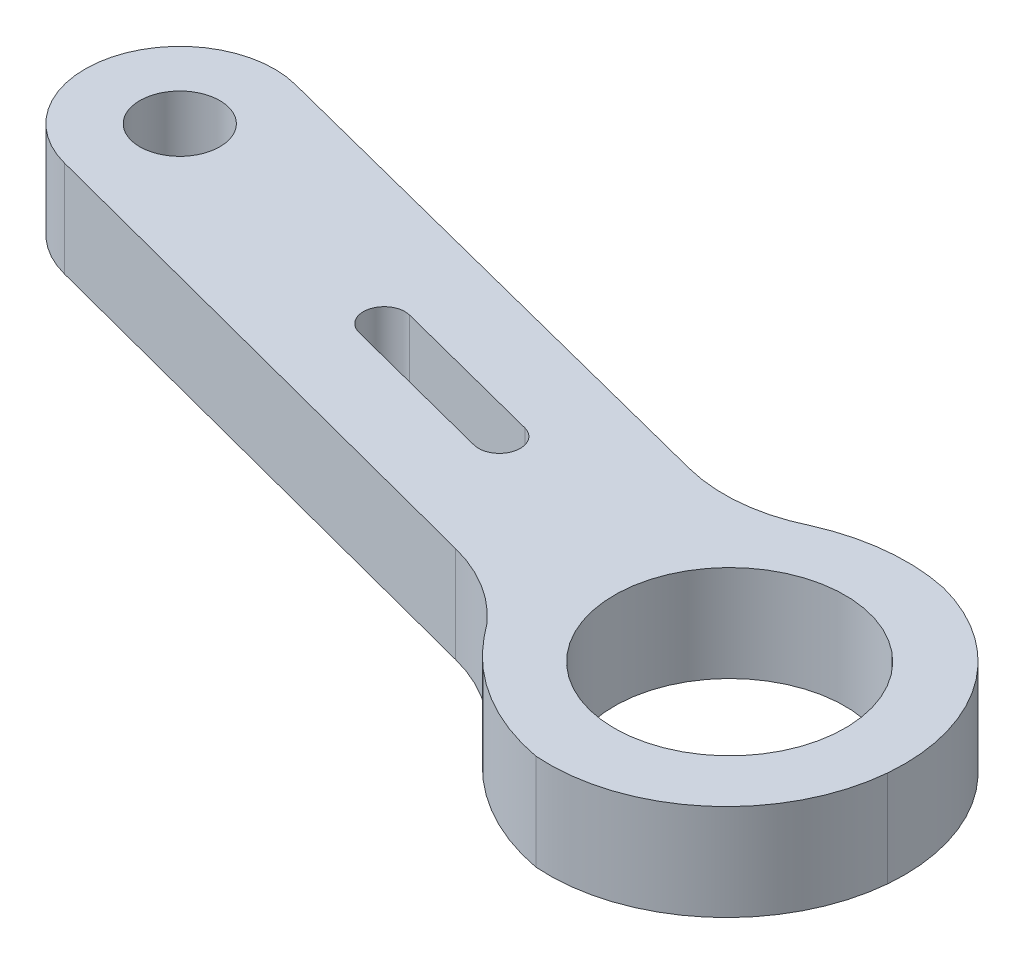
ISO-10303-21;
HEADER;
FILE_DESCRIPTION(('STEP AP214'),'2;1');
FILE_NAME('part.step','',(''),(''),'','','');
FILE_SCHEMA(('AUTOMOTIVE_DESIGN { 1 0 10303 214 1 1 1 1 }'));
ENDSEC;
DATA;
#1=APPLICATION_CONTEXT('core data for automotive mechanical design processes');
#2=APPLICATION_PROTOCOL_DEFINITION('international standard','automotive_design',2000,#1);
#3=PRODUCT_CONTEXT('',#1,'mechanical');
#4=PRODUCT('Part','Part','',(#3));
#5=PRODUCT_RELATED_PRODUCT_CATEGORY('part','',(#4));
#6=PRODUCT_DEFINITION_FORMATION('','',#4);
#7=PRODUCT_DEFINITION_CONTEXT('part definition',#1,'design');
#8=PRODUCT_DEFINITION('design','',#6,#7);
#9=PRODUCT_DEFINITION_SHAPE('','',#8);
#10=(LENGTH_UNIT() NAMED_UNIT(*) SI_UNIT(.MILLI.,.METRE.));
#11=(NAMED_UNIT(*) PLANE_ANGLE_UNIT() SI_UNIT($,.RADIAN.));
#12=(NAMED_UNIT(*) SI_UNIT($,.STERADIAN.) SOLID_ANGLE_UNIT());
#13=UNCERTAINTY_MEASURE_WITH_UNIT(LENGTH_MEASURE(1.E-05),#10,'distance_accuracy_value','');
#14=(GEOMETRIC_REPRESENTATION_CONTEXT(3) GLOBAL_UNCERTAINTY_ASSIGNED_CONTEXT((#13)) GLOBAL_UNIT_ASSIGNED_CONTEXT((#10,
#11,#12)) REPRESENTATION_CONTEXT('',''));
#15=CARTESIAN_POINT('',(0.,0.,0.));
#16=DIRECTION('',(0.,0.,1.));
#17=DIRECTION('',(1.,0.,0.));
#18=AXIS2_PLACEMENT_3D('',#15,#16,#17);
#19=CARTESIAN_POINT('',(257.815804742871,3.,-78.382041713446));
#20=DIRECTION('',(0.,-1.,0.));
#21=DIRECTION('',(0.,0.,-1.));
#22=AXIS2_PLACEMENT_3D('',#19,#20,#21);
#23=CYLINDRICAL_SURFACE('',#22,0.649999996780431);
#24=CARTESIAN_POINT('',(257.815804742871,0.,-78.382041713446));
#25=DIRECTION('',(0.,1.,0.));
#26=DIRECTION('',(0.,0.,1.));
#27=AXIS2_PLACEMENT_3D('',#24,#25,#26);
#28=CIRCLE('',#27,0.649999996780431);
#29=CARTESIAN_POINT('',(257.650550116745,0.,-77.7533996019403));
#30=VERTEX_POINT('',#29);
#31=CARTESIAN_POINT('',(257.981059368998,0.,-79.0106838249517));
#32=VERTEX_POINT('',#31);
#33=EDGE_CURVE('E192',#30,#32,#28,.T.);
#34=ORIENTED_EDGE('',*,*,#33,.F.);
#35=DIRECTION('',(0.,-1.,0.));
#36=VECTOR('',#35,1.);
#37=CARTESIAN_POINT('',(257.650550116745,3.,-77.7533996019403));
#38=LINE('',#37,#36);
#39=CARTESIAN_POINT('',(257.650550116745,3.,-77.7533996019403));
#40=VERTEX_POINT('',#39);
#41=EDGE_CURVE('E11',#40,#30,#38,.T.);
#42=ORIENTED_EDGE('',*,*,#41,.F.);
#43=CARTESIAN_POINT('',(257.815804742871,3.,-78.382041713446));
#44=DIRECTION('',(0.,1.,0.));
#45=DIRECTION('',(0.,0.,1.));
#46=AXIS2_PLACEMENT_3D('',#43,#44,#45);
#47=CIRCLE('',#46,0.649999996780431);
#48=CARTESIAN_POINT('',(257.981059368998,3.,-79.0106838249517));
#49=VERTEX_POINT('',#48);
#50=EDGE_CURVE('E155',#40,#49,#47,.T.);
#51=ORIENTED_EDGE('',*,*,#50,.T.);
#52=DIRECTION('',(0.,-1.,0.));
#53=VECTOR('',#52,1.);
#54=CARTESIAN_POINT('',(257.981059368998,3.,-79.0106838249517));
#55=LINE('',#54,#53);
#56=EDGE_CURVE('E56',#49,#32,#55,.T.);
#57=ORIENTED_EDGE('',*,*,#56,.T.);
#58=EDGE_LOOP('',(#34,#42,#51,#57));
#59=FACE_BOUND('',#58,.T.);
#60=ADVANCED_FACE('F37',(#59),#23,.F.);
#61=CARTESIAN_POINT('',(34.8545373072246,3.,-135.193104051674));
#62=DIRECTION('',(0.249649650750462,0.,-0.968336228734716));
#63=DIRECTION('',(-0.968336228734716,0.,-0.249649650750462));
#64=AXIS2_PLACEMENT_3D('',#61,#62,#63);
#65=PLANE('',#64);
#66=DIRECTION('',(0.968336228734716,0.,0.249649650750462));
#67=VECTOR('',#66,1.);
#68=CARTESIAN_POINT('',(34.8545373072246,0.,-135.193104051674));
#69=LINE('',#68,#67);
#70=CARTESIAN_POINT('',(252.804001409949,0.,-79.0029027766564));
#71=VERTEX_POINT('',#70);
#72=EDGE_CURVE('E143',#71,#30,#69,.T.);
#73=ORIENTED_EDGE('',*,*,#72,.F.);
#74=DIRECTION('',(0.,-1.,0.));
#75=VECTOR('',#74,1.);
#76=CARTESIAN_POINT('',(252.804001409949,3.,-79.0029027766564));
#77=LINE('',#76,#75);
#78=CARTESIAN_POINT('',(252.804001409949,3.,-79.0029027766564));
#79=VERTEX_POINT('',#78);
#80=EDGE_CURVE('E47',#79,#71,#77,.T.);
#81=ORIENTED_EDGE('',*,*,#80,.F.);
#82=DIRECTION('',(0.968336228734716,0.,0.249649650750462));
#83=VECTOR('',#82,1.);
#84=CARTESIAN_POINT('',(34.8545373072246,3.,-135.193104051674));
#85=LINE('',#84,#83);
#86=EDGE_CURVE('E141',#79,#40,#85,.T.);
#87=ORIENTED_EDGE('',*,*,#86,.T.);
#88=ORIENTED_EDGE('',*,*,#41,.T.);
#89=EDGE_LOOP('',(#73,#81,#87,#88));
#90=FACE_BOUND('',#89,.T.);
#91=ADVANCED_FACE('F140',(#90),#65,.T.);
#92=CARTESIAN_POINT('',(252.9692551515,3.,-79.6315451290607));
#93=DIRECTION('',(0.,-1.,0.));
#94=DIRECTION('',(0.,0.,-1.));
#95=AXIS2_PLACEMENT_3D('',#92,#93,#94);
#96=CYLINDRICAL_SURFACE('',#95,0.650000004871457);
#97=CARTESIAN_POINT('',(252.9692551515,0.,-79.6315451290607));
#98=DIRECTION('',(0.,1.,0.));
#99=DIRECTION('',(0.,0.,1.));
#100=AXIS2_PLACEMENT_3D('',#97,#98,#99);
#101=CIRCLE('',#100,0.650000004871457);
#102=CARTESIAN_POINT('',(253.134508893051,0.,-80.2601874814649));
#103=VERTEX_POINT('',#102);
#104=EDGE_CURVE('E195',#103,#71,#101,.T.);
#105=ORIENTED_EDGE('',*,*,#104,.F.);
#106=DIRECTION('',(0.,-1.,0.));
#107=VECTOR('',#106,1.);
#108=CARTESIAN_POINT('',(253.134508893051,3.,-80.2601874814649));
#109=LINE('',#108,#107);
#110=CARTESIAN_POINT('',(253.134508893051,3.,-80.2601874814649));
#111=VERTEX_POINT('',#110);
#112=EDGE_CURVE('E96',#111,#103,#109,.T.);
#113=ORIENTED_EDGE('',*,*,#112,.F.);
#114=CARTESIAN_POINT('',(252.9692551515,3.,-79.6315451290607));
#115=DIRECTION('',(0.,1.,0.));
#116=DIRECTION('',(0.,0.,1.));
#117=AXIS2_PLACEMENT_3D('',#114,#115,#116);
#118=CIRCLE('',#117,0.650000004871457);
#119=EDGE_CURVE('E154',#111,#79,#118,.T.);
#120=ORIENTED_EDGE('',*,*,#119,.T.);
#121=ORIENTED_EDGE('',*,*,#80,.T.);
#122=EDGE_LOOP('',(#105,#113,#120,#121));
#123=FACE_BOUND('',#122,.T.);
#124=ADVANCED_FACE('F157',(#123),#96,.F.);
#125=CARTESIAN_POINT('',(262.893149615823,3.,-85.3209545811391));
#126=DIRECTION('',(0.,-1.,0.));
#127=DIRECTION('',(0.,0.,-1.));
#128=AXIS2_PLACEMENT_3D('',#125,#126,#127);
#129=CYLINDRICAL_SURFACE('',#128,4.99988028430342);
#130=CARTESIAN_POINT('',(262.893149615823,0.,-85.3209545811391));
#131=DIRECTION('',(0.,1.,0.));
#132=DIRECTION('',(0.,0.,1.));
#133=AXIS2_PLACEMENT_3D('',#130,#131,#132);
#134=CIRCLE('',#133,4.99988028430342);
#135=CARTESIAN_POINT('',(261.654207062285,0.,-80.4770074090076));
#136=VERTEX_POINT('',#135);
#137=CARTESIAN_POINT('',(265.086550742752,0.,-80.8278716357938));
#138=VERTEX_POINT('',#137);
#139=EDGE_CURVE('E170',#136,#138,#134,.T.);
#140=ORIENTED_EDGE('',*,*,#139,.F.);
#141=DIRECTION('',(0.,-1.,0.));
#142=VECTOR('',#141,1.);
#143=CARTESIAN_POINT('',(261.654207062285,3.,-80.4770074090076));
#144=LINE('',#143,#142);
#145=CARTESIAN_POINT('',(261.654207062285,3.,-80.4770074090076));
#146=VERTEX_POINT('',#145);
#147=EDGE_CURVE('E41',#146,#136,#144,.T.);
#148=ORIENTED_EDGE('',*,*,#147,.F.);
#149=CARTESIAN_POINT('',(262.893149615823,3.,-85.3209545811391));
#150=DIRECTION('',(0.,1.,0.));
#151=DIRECTION('',(0.,0.,1.));
#152=AXIS2_PLACEMENT_3D('',#149,#150,#151);
#153=CIRCLE('',#152,4.99988028430342);
#154=CARTESIAN_POINT('',(265.086550742752,3.,-80.8278716357938));
#155=VERTEX_POINT('',#154);
#156=EDGE_CURVE('E206',#146,#155,#153,.T.);
#157=ORIENTED_EDGE('',*,*,#156,.T.);
#158=DIRECTION('',(0.,-1.,0.));
#159=VECTOR('',#158,1.);
#160=CARTESIAN_POINT('',(265.086550742752,3.,-80.8278716357938));
#161=LINE('',#160,#159);
#162=EDGE_CURVE('E169',#155,#138,#161,.T.);
#163=ORIENTED_EDGE('',*,*,#162,.T.);
#164=EDGE_LOOP('',(#140,#148,#157,#163));
#165=FACE_BOUND('',#164,.T.);
#166=ADVANCED_FACE('F39',(#165),#129,.F.);
#167=CARTESIAN_POINT('',(35.4205363112198,3.,-138.383575562626));
#168=DIRECTION('',(-0.247965230072133,0.,0.968768932550623));
#169=DIRECTION('',(0.968768932550623,0.,0.247965230072133));
#170=AXIS2_PLACEMENT_3D('',#167,#168,#169);
#171=PLANE('',#170);
#172=DIRECTION('',(-0.968768932550623,0.,-0.247965230072133));
#173=VECTOR('',#172,1.);
#174=CARTESIAN_POINT('',(35.4205363112198,0.,-138.383575562626));
#175=LINE('',#174,#173);
#176=CARTESIAN_POINT('',(245.112048773723,0.,-84.7111234588621));
#177=VERTEX_POINT('',#176);
#178=EDGE_CURVE('E173',#136,#177,#175,.T.);
#179=ORIENTED_EDGE('',*,*,#178,.T.);
#180=DIRECTION('',(0.,-1.,0.));
#181=VECTOR('',#180,1.);
#182=CARTESIAN_POINT('',(245.112048773723,3.,-84.7111234588621));
#183=LINE('',#182,#181);
#184=CARTESIAN_POINT('',(245.112048773723,3.,-84.7111234588621));
#185=VERTEX_POINT('',#184);
#186=EDGE_CURVE('E225',#185,#177,#183,.T.);
#187=ORIENTED_EDGE('',*,*,#186,.F.);
#188=DIRECTION('',(-0.968768932550623,0.,-0.247965230072133));
#189=VECTOR('',#188,1.);
#190=CARTESIAN_POINT('',(35.4205363112198,3.,-138.383575562626));
#191=LINE('',#190,#189);
#192=EDGE_CURVE('E234',#146,#185,#191,.T.);
#193=ORIENTED_EDGE('',*,*,#192,.F.);
#194=ORIENTED_EDGE('',*,*,#147,.T.);
#195=EDGE_LOOP('',(#179,#187,#193,#194));
#196=FACE_BOUND('',#195,.T.);
#197=ADVANCED_FACE('F233',(#196),#171,.F.);
#198=CARTESIAN_POINT('',(244.373787095024,3.,-81.8475683954791));
#199=DIRECTION('',(0.,-1.,0.));
#200=DIRECTION('',(0.,0.,-1.));
#201=AXIS2_PLACEMENT_3D('',#198,#199,#200);
#202=CYLINDRICAL_SURFACE('',#201,2.95719087338176);
#203=CARTESIAN_POINT('',(244.373787095024,0.,-81.8475683954791));
#204=DIRECTION('',(0.,1.,0.));
#205=DIRECTION('',(0.,0.,1.));
#206=AXIS2_PLACEMENT_3D('',#203,#204,#205);
#207=CIRCLE('',#206,2.95719087338176);
#208=CARTESIAN_POINT('',(243.635524689578,0.,-78.9840135354024));
#209=VERTEX_POINT('',#208);
#210=EDGE_CURVE('E175',#177,#209,#207,.T.);
#211=ORIENTED_EDGE('',*,*,#210,.T.);
#212=DIRECTION('',(0.,-1.,0.));
#213=VECTOR('',#212,1.);
#214=CARTESIAN_POINT('',(243.635524689578,3.,-78.9840135354024));
#215=LINE('',#214,#213);
#216=CARTESIAN_POINT('',(243.635524689578,3.,-78.9840135354024));
#217=VERTEX_POINT('',#216);
#218=EDGE_CURVE('E223',#217,#209,#215,.T.);
#219=ORIENTED_EDGE('',*,*,#218,.F.);
#220=CARTESIAN_POINT('',(244.373787095024,3.,-81.8475683954791));
#221=DIRECTION('',(0.,1.,0.));
#222=DIRECTION('',(0.,0.,1.));
#223=AXIS2_PLACEMENT_3D('',#220,#221,#222);
#224=CIRCLE('',#223,2.95719087338176);
#225=EDGE_CURVE('E276',#185,#217,#224,.T.);
#226=ORIENTED_EDGE('',*,*,#225,.F.);
#227=ORIENTED_EDGE('',*,*,#186,.T.);
#228=EDGE_LOOP('',(#211,#219,#226,#227));
#229=FACE_BOUND('',#228,.T.);
#230=ADVANCED_FACE('F275',(#229),#202,.T.);
#231=CARTESIAN_POINT('',(34.8920864861608,3.,-133.529832655757));
#232=DIRECTION('',(0.252816821285472,0.,-0.967514162622496));
#233=DIRECTION('',(-0.967514162622496,0.,-0.252816821285472));
#234=AXIS2_PLACEMENT_3D('',#231,#232,#233);
#235=PLANE('',#234);
#236=DIRECTION('',(0.967514162622496,0.,0.252816821285472));
#237=VECTOR('',#236,1.);
#238=CARTESIAN_POINT('',(34.8920864861608,0.,-133.529832655757));
#239=LINE('',#238,#237);
#240=CARTESIAN_POINT('',(260.167543030857,0.,-74.6641053749409));
#241=VERTEX_POINT('',#240);
#242=EDGE_CURVE('E177',#209,#241,#239,.T.);
#243=ORIENTED_EDGE('',*,*,#242,.T.);
#244=DIRECTION('',(0.,-1.,0.));
#245=VECTOR('',#244,1.);
#246=CARTESIAN_POINT('',(260.167543030857,3.,-74.6641053749409));
#247=LINE('',#246,#245);
#248=CARTESIAN_POINT('',(260.167543030857,3.,-74.6641053749409));
#249=VERTEX_POINT('',#248);
#250=EDGE_CURVE('E221',#249,#241,#247,.T.);
#251=ORIENTED_EDGE('',*,*,#250,.F.);
#252=DIRECTION('',(0.967514162622496,0.,0.252816821285472));
#253=VECTOR('',#252,1.);
#254=CARTESIAN_POINT('',(34.8920864861608,3.,-133.529832655757));
#255=LINE('',#254,#253);
#256=EDGE_CURVE('E274',#217,#249,#255,.T.);
#257=ORIENTED_EDGE('',*,*,#256,.F.);
#258=ORIENTED_EDGE('',*,*,#218,.T.);
#259=EDGE_LOOP('',(#243,#251,#257,#258));
#260=FACE_BOUND('',#259,.T.);
#261=ADVANCED_FACE('F272',(#260),#235,.F.);
#262=CARTESIAN_POINT('',(258.928599023243,3.,-69.8200585315926));
#263=DIRECTION('',(0.,-1.,0.));
#264=DIRECTION('',(0.,0.,-1.));
#265=AXIS2_PLACEMENT_3D('',#262,#263,#264);
#266=CYLINDRICAL_SURFACE('',#265,4.99997720740354);
#267=CARTESIAN_POINT('',(258.928599023243,0.,-69.8200585315926));
#268=DIRECTION('',(0.,1.,0.));
#269=DIRECTION('',(0.,0.,1.));
#270=AXIS2_PLACEMENT_3D('',#267,#268,#269);
#271=CIRCLE('',#270,4.99997720740354);
#272=CARTESIAN_POINT('',(263.00998110044,0.,-72.7083265964514));
#273=VERTEX_POINT('',#272);
#274=EDGE_CURVE('E180',#273,#241,#271,.T.);
#275=ORIENTED_EDGE('',*,*,#274,.F.);
#276=DIRECTION('',(0.,-1.,0.));
#277=VECTOR('',#276,1.);
#278=CARTESIAN_POINT('',(263.00998110044,3.,-72.7083265964514));
#279=LINE('',#278,#277);
#280=CARTESIAN_POINT('',(263.00998110044,3.,-72.7083265964514));
#281=VERTEX_POINT('',#280);
#282=EDGE_CURVE('E219',#281,#273,#279,.T.);
#283=ORIENTED_EDGE('',*,*,#282,.F.);
#284=CARTESIAN_POINT('',(258.928599023243,3.,-69.8200585315926));
#285=DIRECTION('',(0.,1.,0.));
#286=DIRECTION('',(0.,0.,1.));
#287=AXIS2_PLACEMENT_3D('',#284,#285,#286);
#288=CIRCLE('',#287,4.99997720740354);
#289=EDGE_CURVE('E269',#281,#249,#288,.T.);
#290=ORIENTED_EDGE('',*,*,#289,.T.);
#291=ORIENTED_EDGE('',*,*,#250,.T.);
#292=EDGE_LOOP('',(#275,#283,#290,#291));
#293=FACE_BOUND('',#292,.T.);
#294=ADVANCED_FACE('F266',(#293),#266,.F.);
#295=CARTESIAN_POINT('',(268.27348849085,3.,-76.9519928822654));
#296=DIRECTION('',(0.,-1.,0.));
#297=DIRECTION('',(0.,0.,-1.));
#298=AXIS2_PLACEMENT_3D('',#295,#296,#297);
#299=CYLINDRICAL_SURFACE('',#298,6.76115475301753);
#300=CARTESIAN_POINT('',(268.27348849085,0.,-76.9519928822654));
#301=DIRECTION('',(0.,1.,0.));
#302=DIRECTION('',(0.,0.,1.));
#303=AXIS2_PLACEMENT_3D('',#300,#301,#302);
#304=CIRCLE('',#303,6.76115475301753);
#305=CARTESIAN_POINT('',(267.027735224084,0.,-70.3065950467259));
#306=VERTEX_POINT('',#305);
#307=EDGE_CURVE('E183',#273,#306,#304,.T.);
#308=ORIENTED_EDGE('',*,*,#307,.T.);
#309=DIRECTION('',(0.,-1.,0.));
#310=VECTOR('',#309,1.);
#311=CARTESIAN_POINT('',(267.027735224084,3.,-70.3065950467259));
#312=LINE('',#311,#310);
#313=CARTESIAN_POINT('',(267.027735224084,3.,-70.3065950467259));
#314=VERTEX_POINT('',#313);
#315=EDGE_CURVE('E216',#314,#306,#312,.T.);
#316=ORIENTED_EDGE('',*,*,#315,.F.);
#317=CARTESIAN_POINT('',(268.27348849085,3.,-76.9519928822654));
#318=DIRECTION('',(0.,1.,0.));
#319=DIRECTION('',(0.,0.,1.));
#320=AXIS2_PLACEMENT_3D('',#317,#318,#319);
#321=CIRCLE('',#320,6.76115475301753);
#322=EDGE_CURVE('E262',#281,#314,#321,.T.);
#323=ORIENTED_EDGE('',*,*,#322,.F.);
#324=ORIENTED_EDGE('',*,*,#282,.T.);
#325=EDGE_LOOP('',(#308,#316,#323,#324));
#326=FACE_BOUND('',#325,.T.);
#327=ADVANCED_FACE('F261',(#326),#299,.T.);
#328=CARTESIAN_POINT('',(267.441397085972,3.,-75.8448269153172));
#329=DIRECTION('',(0.,-1.,0.));
#330=DIRECTION('',(0.,0.,-1.));
#331=AXIS2_PLACEMENT_3D('',#328,#329,#330);
#332=CYLINDRICAL_SURFACE('',#331,5.55365900702055);
#333=CARTESIAN_POINT('',(267.441397085972,0.,-75.8448269153172));
#334=DIRECTION('',(0.,1.,0.));
#335=DIRECTION('',(0.,0.,1.));
#336=AXIS2_PLACEMENT_3D('',#333,#334,#335);
#337=CIRCLE('',#336,5.55365900702055);
#338=CARTESIAN_POINT('',(272.972563608306,0.,-75.3455021027188));
#339=VERTEX_POINT('',#338);
#340=EDGE_CURVE('E185',#306,#339,#337,.T.);
#341=ORIENTED_EDGE('',*,*,#340,.T.);
#342=DIRECTION('',(0.,-1.,0.));
#343=VECTOR('',#342,1.);
#344=CARTESIAN_POINT('',(272.972563608306,3.,-75.3455021027188));
#345=LINE('',#344,#343);
#346=CARTESIAN_POINT('',(272.972563608306,3.,-75.3455021027188));
#347=VERTEX_POINT('',#346);
#348=EDGE_CURVE('E213',#347,#339,#345,.T.);
#349=ORIENTED_EDGE('',*,*,#348,.F.);
#350=CARTESIAN_POINT('',(267.441397085972,3.,-75.8448269153172));
#351=DIRECTION('',(0.,1.,0.));
#352=DIRECTION('',(0.,0.,1.));
#353=AXIS2_PLACEMENT_3D('',#350,#351,#352);
#354=CIRCLE('',#353,5.55365900702055);
#355=EDGE_CURVE('E257',#314,#347,#354,.T.);
#356=ORIENTED_EDGE('',*,*,#355,.F.);
#357=ORIENTED_EDGE('',*,*,#315,.T.);
#358=EDGE_LOOP('',(#341,#349,#356,#357));
#359=FACE_BOUND('',#358,.T.);
#360=ADVANCED_FACE('F256',(#359),#332,.T.);
#361=CARTESIAN_POINT('',(267.441825061311,3.,-75.8451286022897));
#362=DIRECTION('',(0.,-1.,0.));
#363=DIRECTION('',(0.,0.,-1.));
#364=AXIS2_PLACEMENT_3D('',#361,#362,#363);
#365=CYLINDRICAL_SURFACE('',#364,5.55325989976049);
#366=CARTESIAN_POINT('',(267.441825061311,0.,-75.8451286022897));
#367=DIRECTION('',(0.,1.,0.));
#368=DIRECTION('',(0.,0.,1.));
#369=AXIS2_PLACEMENT_3D('',#366,#367,#368);
#370=CIRCLE('',#369,5.55325989976049);
#371=CARTESIAN_POINT('',(268.830075410294,0.,-81.2220660654592));
#372=VERTEX_POINT('',#371);
#373=EDGE_CURVE('E187',#339,#372,#370,.T.);
#374=ORIENTED_EDGE('',*,*,#373,.T.);
#375=DIRECTION('',(0.,-1.,0.));
#376=VECTOR('',#375,1.);
#377=CARTESIAN_POINT('',(268.830075410294,3.,-81.2220660654592));
#378=LINE('',#377,#376);
#379=CARTESIAN_POINT('',(268.830075410294,3.,-81.2220660654592));
#380=VERTEX_POINT('',#379);
#381=EDGE_CURVE('E210',#380,#372,#378,.T.);
#382=ORIENTED_EDGE('',*,*,#381,.F.);
#383=CARTESIAN_POINT('',(267.441825061311,3.,-75.8451286022897));
#384=DIRECTION('',(0.,1.,0.));
#385=DIRECTION('',(0.,0.,1.));
#386=AXIS2_PLACEMENT_3D('',#383,#384,#385);
#387=CIRCLE('',#386,5.55325989976049);
#388=EDGE_CURVE('E253',#347,#380,#387,.T.);
#389=ORIENTED_EDGE('',*,*,#388,.F.);
#390=ORIENTED_EDGE('',*,*,#348,.T.);
#391=EDGE_LOOP('',(#374,#382,#389,#390));
#392=FACE_BOUND('',#391,.T.);
#393=ADVANCED_FACE('F250',(#392),#365,.T.);
#394=CARTESIAN_POINT('',(244.373787095024,3.,-81.8475683954791));
#395=DIRECTION('',(0.,-1.,0.));
#396=DIRECTION('',(0.,0.,-1.));
#397=AXIS2_PLACEMENT_3D('',#394,#395,#396);
#398=CYLINDRICAL_SURFACE('',#397,1.25000000000001);
#399=CARTESIAN_POINT('',(244.373787095024,3.,-81.8475683954791));
#400=DIRECTION('',(0.,1.,0.));
#401=DIRECTION('',(0.,0.,1.));
#402=AXIS2_PLACEMENT_3D('',#399,#400,#401);
#403=CIRCLE('',#402,1.25000000000001);
#404=CARTESIAN_POINT('',(244.373787095024,3.,-80.597568395479));
#405=VERTEX_POINT('',#404);
#406=EDGE_CURVE('E160',#405,#405,#403,.T.);
#407=ORIENTED_EDGE('',*,*,#406,.T.);
#408=EDGE_LOOP('',(#407));
#409=FACE_BOUND('',#408,.T.);
#410=CARTESIAN_POINT('',(244.373787095024,0.,-81.8475683954791));
#411=DIRECTION('',(0.,1.,0.));
#412=DIRECTION('',(0.,0.,1.));
#413=AXIS2_PLACEMENT_3D('',#410,#411,#412);
#414=CIRCLE('',#413,1.25000000000001);
#415=CARTESIAN_POINT('',(244.373787095024,0.,-80.597568395479));
#416=VERTEX_POINT('',#415);
#417=EDGE_CURVE('E200',#416,#416,#414,.T.);
#418=ORIENTED_EDGE('',*,*,#417,.F.);
#419=EDGE_LOOP('',(#418));
#420=FACE_BOUND('',#419,.T.);
#421=ADVANCED_FACE('F290',(#409,#420),#398,.F.);
#422=CARTESIAN_POINT('',(35.1790791675035,3.,-136.451927926665));
#423=DIRECTION('',(-0.249649655562816,0.,0.968336227494029));
#424=DIRECTION('',(0.968336227494029,0.,0.249649655562816));
#425=AXIS2_PLACEMENT_3D('',#422,#423,#424);
#426=PLANE('',#425);
#427=DIRECTION('',(-0.968336227494029,0.,-0.249649655562816));
#428=VECTOR('',#427,1.);
#429=CARTESIAN_POINT('',(35.1790791675035,0.,-136.451927926665));
#430=LINE('',#429,#428);
#431=EDGE_CURVE('E197',#32,#103,#430,.T.);
#432=ORIENTED_EDGE('',*,*,#431,.F.);
#433=ORIENTED_EDGE('',*,*,#56,.F.);
#434=DIRECTION('',(-0.968336227494029,0.,-0.249649655562816));
#435=VECTOR('',#434,1.);
#436=CARTESIAN_POINT('',(35.1790791675035,3.,-136.451927926665));
#437=LINE('',#436,#435);
#438=EDGE_CURVE('E158',#49,#111,#437,.T.);
#439=ORIENTED_EDGE('',*,*,#438,.T.);
#440=ORIENTED_EDGE('',*,*,#112,.T.);
#441=EDGE_LOOP('',(#432,#433,#439,#440));
#442=FACE_BOUND('',#441,.T.);
#443=ADVANCED_FACE('F288',(#442),#426,.T.);
#444=CARTESIAN_POINT('',(267.568291859667,3.,-75.2322167223994));
#445=DIRECTION('',(0.,-1.,0.));
#446=DIRECTION('',(0.,0.,-1.));
#447=AXIS2_PLACEMENT_3D('',#444,#445,#446);
#448=CYLINDRICAL_SURFACE('',#447,6.12130646849069);
#449=CARTESIAN_POINT('',(267.568291859667,0.,-75.2322167223994));
#450=DIRECTION('',(0.,1.,0.));
#451=DIRECTION('',(0.,0.,1.));
#452=AXIS2_PLACEMENT_3D('',#449,#450,#451);
#453=CIRCLE('',#452,6.12130646849069);
#454=EDGE_CURVE('E189',#372,#138,#453,.T.);
#455=ORIENTED_EDGE('',*,*,#454,.T.);
#456=ORIENTED_EDGE('',*,*,#162,.F.);
#457=CARTESIAN_POINT('',(267.568291859667,3.,-75.2322167223994));
#458=DIRECTION('',(0.,1.,0.));
#459=DIRECTION('',(0.,0.,1.));
#460=AXIS2_PLACEMENT_3D('',#457,#458,#459);
#461=CIRCLE('',#460,6.12130646849069);
#462=EDGE_CURVE('E287',#380,#155,#461,.T.);
#463=ORIENTED_EDGE('',*,*,#462,.F.);
#464=ORIENTED_EDGE('',*,*,#381,.T.);
#465=EDGE_LOOP('',(#455,#456,#463,#464));
#466=FACE_BOUND('',#465,.T.);
#467=ADVANCED_FACE('F244',(#466),#448,.T.);
#468=CARTESIAN_POINT('',(267.499543018167,3.,-75.8854306088731));
#469=DIRECTION('',(0.,-1.,0.));
#470=DIRECTION('',(0.,0.,-1.));
#471=AXIS2_PLACEMENT_3D('',#468,#469,#470);
#472=CYLINDRICAL_SURFACE('',#471,3.60000000000001);
#473=CARTESIAN_POINT('',(267.499543018167,3.,-75.8854306088731));
#474=DIRECTION('',(0.,1.,0.));
#475=DIRECTION('',(0.,0.,1.));
#476=AXIS2_PLACEMENT_3D('',#473,#474,#475);
#477=CIRCLE('',#476,3.60000000000001);
#478=CARTESIAN_POINT('',(267.499543018167,3.,-72.2854306088731));
#479=VERTEX_POINT('',#478);
#480=EDGE_CURVE('E166',#479,#479,#477,.T.);
#481=ORIENTED_EDGE('',*,*,#480,.T.);
#482=EDGE_LOOP('',(#481));
#483=FACE_BOUND('',#482,.T.);
#484=CARTESIAN_POINT('',(267.499543018167,0.,-75.8854306088731));
#485=DIRECTION('',(0.,1.,0.));
#486=DIRECTION('',(0.,0.,1.));
#487=AXIS2_PLACEMENT_3D('',#484,#485,#486);
#488=CIRCLE('',#487,3.60000000000001);
#489=CARTESIAN_POINT('',(267.499543018167,0.,-72.2854306088731));
#490=VERTEX_POINT('',#489);
#491=EDGE_CURVE('E203',#490,#490,#488,.T.);
#492=ORIENTED_EDGE('',*,*,#491,.F.);
#493=EDGE_LOOP('',(#492));
#494=FACE_BOUND('',#493,.T.);
#495=ADVANCED_FACE('F296',(#483,#494),#472,.F.);
#496=CARTESIAN_POINT('',(0.,3.,0.));
#497=DIRECTION('',(0.,1.,0.));
#498=DIRECTION('',(0.,0.,1.));
#499=AXIS2_PLACEMENT_3D('',#496,#497,#498);
#500=PLANE('',#499);
#501=ORIENTED_EDGE('',*,*,#156,.F.);
#502=ORIENTED_EDGE('',*,*,#192,.T.);
#503=ORIENTED_EDGE('',*,*,#225,.T.);
#504=ORIENTED_EDGE('',*,*,#256,.T.);
#505=ORIENTED_EDGE('',*,*,#289,.F.);
#506=ORIENTED_EDGE('',*,*,#322,.T.);
#507=ORIENTED_EDGE('',*,*,#355,.T.);
#508=ORIENTED_EDGE('',*,*,#388,.T.);
#509=ORIENTED_EDGE('',*,*,#462,.T.);
#510=EDGE_LOOP('',(#501,#502,#503,#504,#505,#506,#507,#508,#509));
#511=FACE_BOUND('',#510,.T.);
#512=ORIENTED_EDGE('',*,*,#50,.F.);
#513=ORIENTED_EDGE('',*,*,#86,.F.);
#514=ORIENTED_EDGE('',*,*,#119,.F.);
#515=ORIENTED_EDGE('',*,*,#438,.F.);
#516=EDGE_LOOP('',(#512,#513,#514,#515));
#517=FACE_BOUND('',#516,.T.);
#518=ORIENTED_EDGE('',*,*,#406,.F.);
#519=EDGE_LOOP('',(#518));
#520=FACE_BOUND('',#519,.T.);
#521=ORIENTED_EDGE('',*,*,#480,.F.);
#522=EDGE_LOOP('',(#521));
#523=FACE_BOUND('',#522,.T.);
#524=ADVANCED_FACE('F151',(#511,#517,#520,#523),#500,.T.);
#525=CARTESIAN_POINT('',(0.,0.,0.));
#526=DIRECTION('',(0.,1.,0.));
#527=DIRECTION('',(0.,0.,1.));
#528=AXIS2_PLACEMENT_3D('',#525,#526,#527);
#529=PLANE('',#528);
#530=ORIENTED_EDGE('',*,*,#139,.T.);
#531=ORIENTED_EDGE('',*,*,#454,.F.);
#532=ORIENTED_EDGE('',*,*,#373,.F.);
#533=ORIENTED_EDGE('',*,*,#340,.F.);
#534=ORIENTED_EDGE('',*,*,#307,.F.);
#535=ORIENTED_EDGE('',*,*,#274,.T.);
#536=ORIENTED_EDGE('',*,*,#242,.F.);
#537=ORIENTED_EDGE('',*,*,#210,.F.);
#538=ORIENTED_EDGE('',*,*,#178,.F.);
#539=EDGE_LOOP('',(#530,#531,#532,#533,#534,#535,#536,#537,#538));
#540=FACE_BOUND('',#539,.T.);
#541=ORIENTED_EDGE('',*,*,#33,.T.);
#542=ORIENTED_EDGE('',*,*,#431,.T.);
#543=ORIENTED_EDGE('',*,*,#104,.T.);
#544=ORIENTED_EDGE('',*,*,#72,.T.);
#545=EDGE_LOOP('',(#541,#542,#543,#544));
#546=FACE_BOUND('',#545,.T.);
#547=ORIENTED_EDGE('',*,*,#417,.T.);
#548=EDGE_LOOP('',(#547));
#549=FACE_BOUND('',#548,.T.);
#550=ORIENTED_EDGE('',*,*,#491,.T.);
#551=EDGE_LOOP('',(#550));
#552=FACE_BOUND('',#551,.T.);
#553=ADVANCED_FACE('F237',(#540,#546,#549,#552),#529,.F.);
#554=CLOSED_SHELL('',(#60,#91,#124,#166,#197,#230,#261,#294,#327,#360,#393,#421,#443,#467,#495,
#524,#553));
#555=MANIFOLD_SOLID_BREP('B2',#554);
#556=ADVANCED_BREP_SHAPE_REPRESENTATION('',(#18,#555),#14);
#557=SHAPE_DEFINITION_REPRESENTATION(#9,#556);
ENDSEC;
END-ISO-10303-21;
